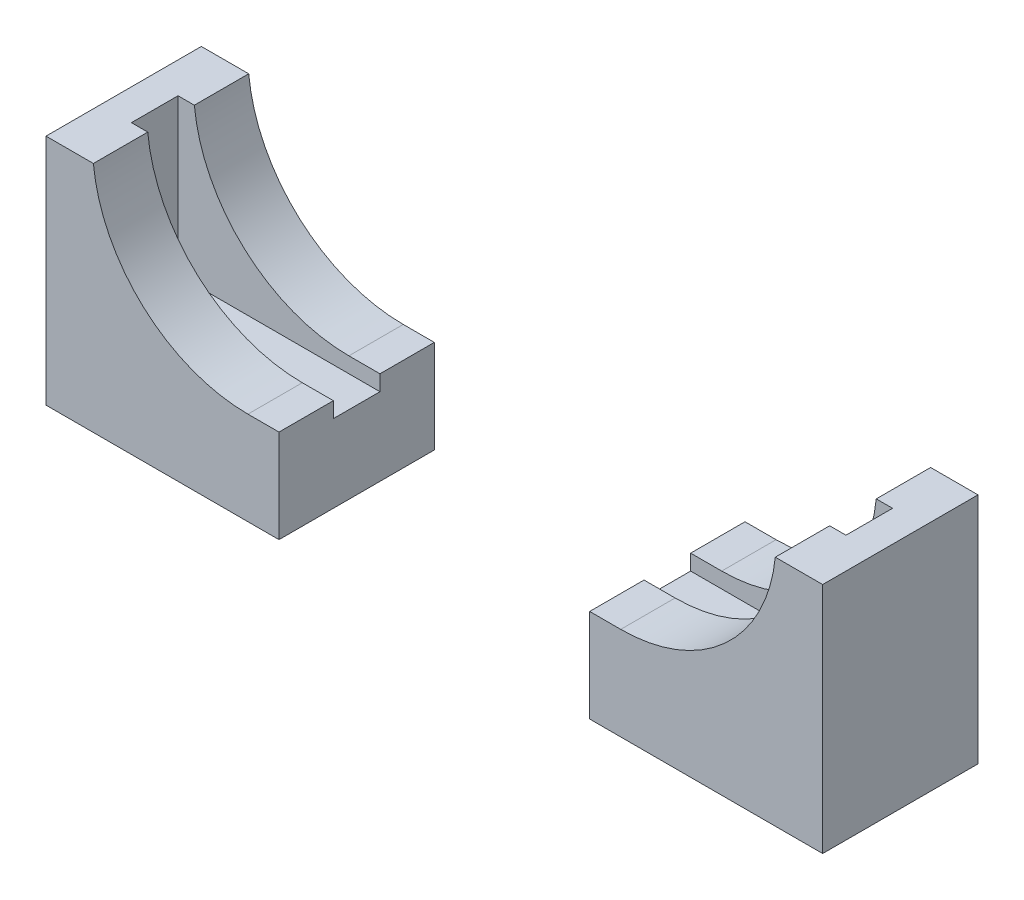
ISO-10303-21;
HEADER;
FILE_DESCRIPTION(('STEP AP214'),'2;1');
FILE_NAME('part.step','',(''),(''),'','','');
FILE_SCHEMA(('AUTOMOTIVE_DESIGN { 1 0 10303 214 1 1 1 1 }'));
ENDSEC;
DATA;
#1=APPLICATION_CONTEXT('core data for automotive mechanical design processes');
#2=APPLICATION_PROTOCOL_DEFINITION('international standard','automotive_design',2000,#1);
#3=PRODUCT_CONTEXT('',#1,'mechanical');
#4=PRODUCT('Part','Part','',(#3));
#5=PRODUCT_RELATED_PRODUCT_CATEGORY('part','',(#4));
#6=PRODUCT_DEFINITION_FORMATION('','',#4);
#7=PRODUCT_DEFINITION_CONTEXT('part definition',#1,'design');
#8=PRODUCT_DEFINITION('design','',#6,#7);
#9=PRODUCT_DEFINITION_SHAPE('','',#8);
#10=(LENGTH_UNIT() NAMED_UNIT(*) SI_UNIT(.MILLI.,.METRE.));
#11=(NAMED_UNIT(*) PLANE_ANGLE_UNIT() SI_UNIT($,.RADIAN.));
#12=(NAMED_UNIT(*) SI_UNIT($,.STERADIAN.) SOLID_ANGLE_UNIT());
#13=UNCERTAINTY_MEASURE_WITH_UNIT(LENGTH_MEASURE(1.E-05),#10,'distance_accuracy_value','');
#14=(GEOMETRIC_REPRESENTATION_CONTEXT(3) GLOBAL_UNCERTAINTY_ASSIGNED_CONTEXT((#13)) GLOBAL_UNIT_ASSIGNED_CONTEXT((#10,
#11,#12)) REPRESENTATION_CONTEXT('',''));
#15=CARTESIAN_POINT('',(0.,0.,0.));
#16=DIRECTION('',(0.,0.,1.));
#17=DIRECTION('',(1.,0.,0.));
#18=AXIS2_PLACEMENT_3D('',#15,#16,#17);
#19=CARTESIAN_POINT('',(25.,15.,5.));
#20=DIRECTION('',(-1.,0.,0.));
#21=DIRECTION('',(0.,0.,1.));
#22=AXIS2_PLACEMENT_3D('',#19,#20,#21);
#23=PLANE('',#22);
#24=DIRECTION('',(0.,0.,-1.));
#25=VECTOR('',#24,1.);
#26=CARTESIAN_POINT('',(25.,0.,5.));
#27=LINE('',#26,#25);
#28=CARTESIAN_POINT('',(25.,0.,5.));
#29=VERTEX_POINT('',#28);
#30=CARTESIAN_POINT('',(25.,0.,-5.));
#31=VERTEX_POINT('',#30);
#32=EDGE_CURVE('E219',#29,#31,#27,.T.);
#33=ORIENTED_EDGE('',*,*,#32,.T.);
#34=DIRECTION('',(0.,-1.,0.));
#35=VECTOR('',#34,1.);
#36=CARTESIAN_POINT('',(25.,15.,-5.));
#37=LINE('',#36,#35);
#38=CARTESIAN_POINT('',(25.,15.,-5.));
#39=VERTEX_POINT('',#38);
#40=EDGE_CURVE('E151',#39,#31,#37,.T.);
#41=ORIENTED_EDGE('',*,*,#40,.F.);
#42=DIRECTION('',(0.,0.,-1.));
#43=VECTOR('',#42,1.);
#44=CARTESIAN_POINT('',(25.,15.,5.));
#45=LINE('',#44,#43);
#46=CARTESIAN_POINT('',(25.,15.,5.));
#47=VERTEX_POINT('',#46);
#48=EDGE_CURVE('E207',#47,#39,#45,.T.);
#49=ORIENTED_EDGE('',*,*,#48,.F.);
#50=DIRECTION('',(0.,-1.,0.));
#51=VECTOR('',#50,1.);
#52=CARTESIAN_POINT('',(25.,15.,5.));
#53=LINE('',#52,#51);
#54=EDGE_CURVE('E204',#47,#29,#53,.T.);
#55=ORIENTED_EDGE('',*,*,#54,.T.);
#56=EDGE_LOOP('',(#33,#41,#49,#55));
#57=FACE_BOUND('',#56,.T.);
#58=ADVANCED_FACE('F44',(#57),#23,.F.);
#59=CARTESIAN_POINT('',(-25.,15.,-5.));
#60=DIRECTION('',(0.,0.,1.));
#61=DIRECTION('',(1.,0.,0.));
#62=AXIS2_PLACEMENT_3D('',#59,#60,#61);
#63=PLANE('',#62);
#64=DIRECTION('',(1.,0.,0.));
#65=VECTOR('',#64,1.);
#66=CARTESIAN_POINT('',(0.,6.,-5.));
#67=LINE('',#66,#65);
#68=CARTESIAN_POINT('',(10.,6.,-5.));
#69=VERTEX_POINT('',#68);
#70=CARTESIAN_POINT('',(12.,6.,-5.));
#71=VERTEX_POINT('',#70);
#72=EDGE_CURVE('E203',#69,#71,#67,.T.);
#73=ORIENTED_EDGE('',*,*,#72,.T.);
#74=CARTESIAN_POINT('',(12.,16.,-5.));
#75=DIRECTION('',(0.,0.,1.));
#76=DIRECTION('',(1.,0.,0.));
#77=AXIS2_PLACEMENT_3D('',#74,#75,#76);
#78=CIRCLE('',#77,10.);
#79=CARTESIAN_POINT('',(21.9498743710662,15.,-5.));
#80=VERTEX_POINT('',#79);
#81=EDGE_CURVE('E154',#71,#80,#78,.T.);
#82=ORIENTED_EDGE('',*,*,#81,.T.);
#83=DIRECTION('',(-1.,0.,0.));
#84=VECTOR('',#83,1.);
#85=CARTESIAN_POINT('',(-25.,15.,-5.));
#86=LINE('',#85,#84);
#87=EDGE_CURVE('E197',#39,#80,#86,.T.);
#88=ORIENTED_EDGE('',*,*,#87,.F.);
#89=ORIENTED_EDGE('',*,*,#40,.T.);
#90=DIRECTION('',(-1.,0.,0.));
#91=VECTOR('',#90,1.);
#92=CARTESIAN_POINT('',(-25.,0.,-5.));
#93=LINE('',#92,#91);
#94=CARTESIAN_POINT('',(10.,0.,-5.));
#95=VERTEX_POINT('',#94);
#96=EDGE_CURVE('E141',#31,#95,#93,.T.);
#97=ORIENTED_EDGE('',*,*,#96,.T.);
#98=DIRECTION('',(0.,1.,0.));
#99=VECTOR('',#98,1.);
#100=CARTESIAN_POINT('',(10.,0.,-5.));
#101=LINE('',#100,#99);
#102=EDGE_CURVE('E133',#95,#69,#101,.T.);
#103=ORIENTED_EDGE('',*,*,#102,.T.);
#104=EDGE_LOOP('',(#73,#82,#88,#89,#97,#103));
#105=FACE_BOUND('',#104,.T.);
#106=ADVANCED_FACE('F46',(#105),#63,.F.);
#107=CARTESIAN_POINT('',(-25.,15.,5.));
#108=DIRECTION('',(0.,0.,-1.));
#109=DIRECTION('',(-1.,0.,0.));
#110=AXIS2_PLACEMENT_3D('',#107,#108,#109);
#111=PLANE('',#110);
#112=DIRECTION('',(1.,0.,0.));
#113=VECTOR('',#112,1.);
#114=CARTESIAN_POINT('',(-25.,15.,5.));
#115=LINE('',#114,#113);
#116=CARTESIAN_POINT('',(21.9498743710662,15.,5.));
#117=VERTEX_POINT('',#116);
#118=EDGE_CURVE('E206',#117,#47,#115,.T.);
#119=ORIENTED_EDGE('',*,*,#118,.F.);
#120=CARTESIAN_POINT('',(12.,16.,5.));
#121=DIRECTION('',(0.,0.,1.));
#122=DIRECTION('',(1.,0.,0.));
#123=AXIS2_PLACEMENT_3D('',#120,#121,#122);
#124=CIRCLE('',#123,10.);
#125=CARTESIAN_POINT('',(12.,6.,5.));
#126=VERTEX_POINT('',#125);
#127=EDGE_CURVE('E192',#126,#117,#124,.T.);
#128=ORIENTED_EDGE('',*,*,#127,.F.);
#129=DIRECTION('',(1.,0.,0.));
#130=VECTOR('',#129,1.);
#131=CARTESIAN_POINT('',(0.,6.,5.));
#132=LINE('',#131,#130);
#133=CARTESIAN_POINT('',(10.,6.,5.));
#134=VERTEX_POINT('',#133);
#135=EDGE_CURVE('E187',#134,#126,#132,.T.);
#136=ORIENTED_EDGE('',*,*,#135,.F.);
#137=DIRECTION('',(0.,1.,0.));
#138=VECTOR('',#137,1.);
#139=CARTESIAN_POINT('',(10.,0.,5.));
#140=LINE('',#139,#138);
#141=CARTESIAN_POINT('',(10.,0.,5.));
#142=VERTEX_POINT('',#141);
#143=EDGE_CURVE('E12',#142,#134,#140,.T.);
#144=ORIENTED_EDGE('',*,*,#143,.F.);
#145=DIRECTION('',(1.,0.,0.));
#146=VECTOR('',#145,1.);
#147=CARTESIAN_POINT('',(-25.,0.,5.));
#148=LINE('',#147,#146);
#149=EDGE_CURVE('E140',#142,#29,#148,.T.);
#150=ORIENTED_EDGE('',*,*,#149,.T.);
#151=ORIENTED_EDGE('',*,*,#54,.F.);
#152=EDGE_LOOP('',(#119,#128,#136,#144,#150,#151));
#153=FACE_BOUND('',#152,.T.);
#154=ADVANCED_FACE('F215',(#153),#111,.F.);
#155=CARTESIAN_POINT('',(0.,15.,0.));
#156=DIRECTION('',(0.,-1.,0.));
#157=DIRECTION('',(0.,0.,-1.));
#158=AXIS2_PLACEMENT_3D('',#155,#156,#157);
#159=PLANE('',#158);
#160=ORIENTED_EDGE('',*,*,#87,.T.);
#161=DIRECTION('',(0.,0.,1.));
#162=VECTOR('',#161,1.);
#163=CARTESIAN_POINT('',(21.9498743710662,15.,-5.));
#164=LINE('',#163,#162);
#165=CARTESIAN_POINT('',(21.9498743710662,15.,-1.5));
#166=VERTEX_POINT('',#165);
#167=EDGE_CURVE('E193',#80,#166,#164,.T.);
#168=ORIENTED_EDGE('',*,*,#167,.T.);
#169=DIRECTION('',(-1.,0.,0.));
#170=VECTOR('',#169,1.);
#171=CARTESIAN_POINT('',(-23.,15.,-1.5));
#172=LINE('',#171,#170);
#173=CARTESIAN_POINT('',(23.,15.,-1.5));
#174=VERTEX_POINT('',#173);
#175=EDGE_CURVE('E48',#174,#166,#172,.T.);
#176=ORIENTED_EDGE('',*,*,#175,.F.);
#177=DIRECTION('',(0.,0.,-1.));
#178=VECTOR('',#177,1.);
#179=CARTESIAN_POINT('',(23.,15.,-1.5));
#180=LINE('',#179,#178);
#181=CARTESIAN_POINT('',(23.,15.,1.5));
#182=VERTEX_POINT('',#181);
#183=EDGE_CURVE('E224',#182,#174,#180,.T.);
#184=ORIENTED_EDGE('',*,*,#183,.F.);
#185=DIRECTION('',(1.,0.,0.));
#186=VECTOR('',#185,1.);
#187=CARTESIAN_POINT('',(-23.,15.,1.5));
#188=LINE('',#187,#186);
#189=CARTESIAN_POINT('',(21.9498743710662,15.,1.5));
#190=VERTEX_POINT('',#189);
#191=EDGE_CURVE('E166',#190,#182,#188,.T.);
#192=ORIENTED_EDGE('',*,*,#191,.F.);
#193=EDGE_CURVE('E196',#190,#117,#164,.T.);
#194=ORIENTED_EDGE('',*,*,#193,.T.);
#195=ORIENTED_EDGE('',*,*,#118,.T.);
#196=ORIENTED_EDGE('',*,*,#48,.T.);
#197=EDGE_LOOP('',(#160,#168,#176,#184,#192,#194,#195,#196));
#198=FACE_BOUND('',#197,.T.);
#199=ADVANCED_FACE('F238',(#198),#159,.F.);
#200=CARTESIAN_POINT('',(0.,0.,0.));
#201=DIRECTION('',(0.,-1.,0.));
#202=DIRECTION('',(0.,0.,-1.));
#203=AXIS2_PLACEMENT_3D('',#200,#201,#202);
#204=PLANE('',#203);
#205=DIRECTION('',(0.,0.,1.));
#206=VECTOR('',#205,1.);
#207=CARTESIAN_POINT('',(10.,0.,-5.));
#208=LINE('',#207,#206);
#209=EDGE_CURVE('E54',#95,#142,#208,.T.);
#210=ORIENTED_EDGE('',*,*,#209,.F.);
#211=ORIENTED_EDGE('',*,*,#96,.F.);
#212=ORIENTED_EDGE('',*,*,#32,.F.);
#213=ORIENTED_EDGE('',*,*,#149,.F.);
#214=EDGE_LOOP('',(#210,#211,#212,#213));
#215=FACE_BOUND('',#214,.T.);
#216=ADVANCED_FACE('F145',(#215),#204,.T.);
#217=CARTESIAN_POINT('',(23.,5.,-1.5));
#218=DIRECTION('',(1.,0.,0.));
#219=DIRECTION('',(0.,0.,-1.));
#220=AXIS2_PLACEMENT_3D('',#217,#218,#219);
#221=PLANE('',#220);
#222=ORIENTED_EDGE('',*,*,#183,.T.);
#223=DIRECTION('',(0.,1.,0.));
#224=VECTOR('',#223,1.);
#225=CARTESIAN_POINT('',(23.,5.,-1.5));
#226=LINE('',#225,#224);
#227=CARTESIAN_POINT('',(23.,5.,-1.5));
#228=VERTEX_POINT('',#227);
#229=EDGE_CURVE('E162',#228,#174,#226,.T.);
#230=ORIENTED_EDGE('',*,*,#229,.F.);
#231=DIRECTION('',(0.,0.,-1.));
#232=VECTOR('',#231,1.);
#233=CARTESIAN_POINT('',(23.,5.,-1.5));
#234=LINE('',#233,#232);
#235=CARTESIAN_POINT('',(23.,5.,1.5));
#236=VERTEX_POINT('',#235);
#237=EDGE_CURVE('E161',#236,#228,#234,.T.);
#238=ORIENTED_EDGE('',*,*,#237,.F.);
#239=DIRECTION('',(0.,1.,0.));
#240=VECTOR('',#239,1.);
#241=CARTESIAN_POINT('',(23.,5.,1.5));
#242=LINE('',#241,#240);
#243=EDGE_CURVE('E177',#236,#182,#242,.T.);
#244=ORIENTED_EDGE('',*,*,#243,.T.);
#245=EDGE_LOOP('',(#222,#230,#238,#244));
#246=FACE_BOUND('',#245,.T.);
#247=ADVANCED_FACE('F229',(#246),#221,.F.);
#248=CARTESIAN_POINT('',(-23.,5.,1.5));
#249=DIRECTION('',(0.,0.,1.));
#250=DIRECTION('',(1.,0.,0.));
#251=AXIS2_PLACEMENT_3D('',#248,#249,#250);
#252=PLANE('',#251);
#253=DIRECTION('',(1.,0.,0.));
#254=VECTOR('',#253,1.);
#255=CARTESIAN_POINT('',(-23.,6.,1.5));
#256=LINE('',#255,#254);
#257=CARTESIAN_POINT('',(10.,6.,1.5));
#258=VERTEX_POINT('',#257);
#259=CARTESIAN_POINT('',(12.,6.,1.5));
#260=VERTEX_POINT('',#259);
#261=EDGE_CURVE('E174',#258,#260,#256,.T.);
#262=ORIENTED_EDGE('',*,*,#261,.T.);
#263=CARTESIAN_POINT('',(12.,16.,1.5));
#264=DIRECTION('',(0.,0.,1.));
#265=DIRECTION('',(1.,0.,0.));
#266=AXIS2_PLACEMENT_3D('',#263,#264,#265);
#267=CIRCLE('',#266,10.);
#268=EDGE_CURVE('E167',#260,#190,#267,.T.);
#269=ORIENTED_EDGE('',*,*,#268,.T.);
#270=ORIENTED_EDGE('',*,*,#191,.T.);
#271=ORIENTED_EDGE('',*,*,#243,.F.);
#272=DIRECTION('',(1.,0.,0.));
#273=VECTOR('',#272,1.);
#274=CARTESIAN_POINT('',(-23.,5.,1.5));
#275=LINE('',#274,#273);
#276=CARTESIAN_POINT('',(10.,5.,1.5));
#277=VERTEX_POINT('',#276);
#278=EDGE_CURVE('E159',#277,#236,#275,.T.);
#279=ORIENTED_EDGE('',*,*,#278,.F.);
#280=DIRECTION('',(0.,1.,0.));
#281=VECTOR('',#280,1.);
#282=CARTESIAN_POINT('',(10.,5.,1.5));
#283=LINE('',#282,#281);
#284=EDGE_CURVE('E63',#277,#258,#283,.T.);
#285=ORIENTED_EDGE('',*,*,#284,.T.);
#286=EDGE_LOOP('',(#262,#269,#270,#271,#279,#285));
#287=FACE_BOUND('',#286,.T.);
#288=ADVANCED_FACE('F247',(#287),#252,.F.);
#289=CARTESIAN_POINT('',(-23.,5.,-1.5));
#290=DIRECTION('',(0.,0.,-1.));
#291=DIRECTION('',(-1.,0.,0.));
#292=AXIS2_PLACEMENT_3D('',#289,#290,#291);
#293=PLANE('',#292);
#294=ORIENTED_EDGE('',*,*,#175,.T.);
#295=CARTESIAN_POINT('',(12.,16.,-1.5));
#296=DIRECTION('',(0.,0.,-1.));
#297=DIRECTION('',(-1.,0.,0.));
#298=AXIS2_PLACEMENT_3D('',#295,#296,#297);
#299=CIRCLE('',#298,10.);
#300=CARTESIAN_POINT('',(12.,6.,-1.5));
#301=VERTEX_POINT('',#300);
#302=EDGE_CURVE('E239',#166,#301,#299,.T.);
#303=ORIENTED_EDGE('',*,*,#302,.T.);
#304=DIRECTION('',(-1.,0.,0.));
#305=VECTOR('',#304,1.);
#306=CARTESIAN_POINT('',(-23.,6.,-1.5));
#307=LINE('',#306,#305);
#308=CARTESIAN_POINT('',(10.,6.,-1.5));
#309=VERTEX_POINT('',#308);
#310=EDGE_CURVE('E184',#301,#309,#307,.T.);
#311=ORIENTED_EDGE('',*,*,#310,.T.);
#312=DIRECTION('',(0.,-1.,0.));
#313=VECTOR('',#312,1.);
#314=CARTESIAN_POINT('',(10.,5.,-1.5));
#315=LINE('',#314,#313);
#316=CARTESIAN_POINT('',(10.,5.,-1.5));
#317=VERTEX_POINT('',#316);
#318=EDGE_CURVE('E182',#309,#317,#315,.T.);
#319=ORIENTED_EDGE('',*,*,#318,.T.);
#320=DIRECTION('',(-1.,0.,0.));
#321=VECTOR('',#320,1.);
#322=CARTESIAN_POINT('',(-23.,5.,-1.5));
#323=LINE('',#322,#321);
#324=EDGE_CURVE('E163',#228,#317,#323,.T.);
#325=ORIENTED_EDGE('',*,*,#324,.F.);
#326=ORIENTED_EDGE('',*,*,#229,.T.);
#327=EDGE_LOOP('',(#294,#303,#311,#319,#325,#326));
#328=FACE_BOUND('',#327,.T.);
#329=ADVANCED_FACE('F235',(#328),#293,.F.);
#330=CARTESIAN_POINT('',(0.,5.,0.));
#331=DIRECTION('',(0.,1.,0.));
#332=DIRECTION('',(0.,0.,1.));
#333=AXIS2_PLACEMENT_3D('',#330,#331,#332);
#334=PLANE('',#333);
#335=DIRECTION('',(0.,0.,-1.));
#336=VECTOR('',#335,1.);
#337=CARTESIAN_POINT('',(10.,5.,0.));
#338=LINE('',#337,#336);
#339=EDGE_CURVE('E148',#277,#317,#338,.T.);
#340=ORIENTED_EDGE('',*,*,#339,.F.);
#341=ORIENTED_EDGE('',*,*,#278,.T.);
#342=ORIENTED_EDGE('',*,*,#237,.T.);
#343=ORIENTED_EDGE('',*,*,#324,.T.);
#344=EDGE_LOOP('',(#340,#341,#342,#343));
#345=FACE_BOUND('',#344,.T.);
#346=ADVANCED_FACE('F246',(#345),#334,.T.);
#347=CARTESIAN_POINT('',(12.,16.,-5.));
#348=DIRECTION('',(0.,0.,1.));
#349=DIRECTION('',(1.,0.,0.));
#350=AXIS2_PLACEMENT_3D('',#347,#348,#349);
#351=CYLINDRICAL_SURFACE('',#350,10.);
#352=DIRECTION('',(0.,0.,1.));
#353=VECTOR('',#352,1.);
#354=CARTESIAN_POINT('',(12.,6.,-5.));
#355=LINE('',#354,#353);
#356=EDGE_CURVE('E165',#260,#126,#355,.T.);
#357=ORIENTED_EDGE('',*,*,#356,.T.);
#358=ORIENTED_EDGE('',*,*,#127,.T.);
#359=ORIENTED_EDGE('',*,*,#193,.F.);
#360=ORIENTED_EDGE('',*,*,#268,.F.);
#361=EDGE_LOOP('',(#357,#358,#359,#360));
#362=FACE_BOUND('',#361,.T.);
#363=ADVANCED_FACE('F271',(#362),#351,.F.);
#364=ORIENTED_EDGE('',*,*,#167,.F.);
#365=ORIENTED_EDGE('',*,*,#81,.F.);
#366=EDGE_CURVE('E189',#71,#301,#355,.T.);
#367=ORIENTED_EDGE('',*,*,#366,.T.);
#368=ORIENTED_EDGE('',*,*,#302,.F.);
#369=EDGE_LOOP('',(#364,#365,#367,#368));
#370=FACE_BOUND('',#369,.T.);
#371=ADVANCED_FACE('F269',(#370),#351,.F.);
#372=CARTESIAN_POINT('',(0.,6.,-5.));
#373=DIRECTION('',(0.,-1.,0.));
#374=DIRECTION('',(0.,0.,-1.));
#375=AXIS2_PLACEMENT_3D('',#372,#373,#374);
#376=PLANE('',#375);
#377=DIRECTION('',(0.,0.,1.));
#378=VECTOR('',#377,1.);
#379=CARTESIAN_POINT('',(10.,6.,-5.));
#380=LINE('',#379,#378);
#381=EDGE_CURVE('E188',#258,#134,#380,.T.);
#382=ORIENTED_EDGE('',*,*,#381,.T.);
#383=ORIENTED_EDGE('',*,*,#135,.T.);
#384=ORIENTED_EDGE('',*,*,#356,.F.);
#385=ORIENTED_EDGE('',*,*,#261,.F.);
#386=EDGE_LOOP('',(#382,#383,#384,#385));
#387=FACE_BOUND('',#386,.T.);
#388=ADVANCED_FACE('F266',(#387),#376,.F.);
#389=ORIENTED_EDGE('',*,*,#366,.F.);
#390=ORIENTED_EDGE('',*,*,#72,.F.);
#391=EDGE_CURVE('E130',#69,#309,#380,.T.);
#392=ORIENTED_EDGE('',*,*,#391,.T.);
#393=ORIENTED_EDGE('',*,*,#310,.F.);
#394=EDGE_LOOP('',(#389,#390,#392,#393));
#395=FACE_BOUND('',#394,.T.);
#396=ADVANCED_FACE('F265',(#395),#376,.F.);
#397=CARTESIAN_POINT('',(10.,0.,-5.));
#398=DIRECTION('',(1.,0.,0.));
#399=DIRECTION('',(0.,0.,-1.));
#400=AXIS2_PLACEMENT_3D('',#397,#398,#399);
#401=PLANE('',#400);
#402=ORIENTED_EDGE('',*,*,#339,.T.);
#403=ORIENTED_EDGE('',*,*,#318,.F.);
#404=ORIENTED_EDGE('',*,*,#391,.F.);
#405=ORIENTED_EDGE('',*,*,#102,.F.);
#406=ORIENTED_EDGE('',*,*,#209,.T.);
#407=ORIENTED_EDGE('',*,*,#143,.T.);
#408=ORIENTED_EDGE('',*,*,#381,.F.);
#409=ORIENTED_EDGE('',*,*,#284,.F.);
#410=EDGE_LOOP('',(#402,#403,#404,#405,#406,#407,#408,#409));
#411=FACE_BOUND('',#410,.T.);
#412=ADVANCED_FACE('F135',(#411),#401,.F.);
#413=CLOSED_SHELL('',(#58,#106,#154,#199,#216,#247,#288,#329,#346,#363,#371,#388,#396,#412));
#414=MANIFOLD_SOLID_BREP('B2',#413);
#415=CARTESIAN_POINT('',(-25.,15.,5.));
#416=DIRECTION('',(1.,0.,0.));
#417=DIRECTION('',(0.,0.,-1.));
#418=AXIS2_PLACEMENT_3D('',#415,#416,#417);
#419=PLANE('',#418);
#420=DIRECTION('',(0.,0.,1.));
#421=VECTOR('',#420,1.);
#422=CARTESIAN_POINT('',(-25.,0.,5.));
#423=LINE('',#422,#421);
#424=CARTESIAN_POINT('',(-25.,0.,-5.));
#425=VERTEX_POINT('',#424);
#426=CARTESIAN_POINT('',(-25.,0.,5.));
#427=VERTEX_POINT('',#426);
#428=EDGE_CURVE('E416',#425,#427,#423,.T.);
#429=ORIENTED_EDGE('',*,*,#428,.T.);
#430=DIRECTION('',(0.,-1.,0.));
#431=VECTOR('',#430,1.);
#432=CARTESIAN_POINT('',(-25.,15.,5.));
#433=LINE('',#432,#431);
#434=CARTESIAN_POINT('',(-25.,15.,5.));
#435=VERTEX_POINT('',#434);
#436=EDGE_CURVE('E418',#435,#427,#433,.T.);
#437=ORIENTED_EDGE('',*,*,#436,.F.);
#438=DIRECTION('',(0.,0.,1.));
#439=VECTOR('',#438,1.);
#440=CARTESIAN_POINT('',(-25.,15.,5.));
#441=LINE('',#440,#439);
#442=CARTESIAN_POINT('',(-25.,15.,-5.));
#443=VERTEX_POINT('',#442);
#444=EDGE_CURVE('E403',#443,#435,#441,.T.);
#445=ORIENTED_EDGE('',*,*,#444,.F.);
#446=DIRECTION('',(0.,-1.,0.));
#447=VECTOR('',#446,1.);
#448=CARTESIAN_POINT('',(-25.,15.,-5.));
#449=LINE('',#448,#447);
#450=EDGE_CURVE('E421',#443,#425,#449,.T.);
#451=ORIENTED_EDGE('',*,*,#450,.T.);
#452=EDGE_LOOP('',(#429,#437,#445,#451));
#453=FACE_BOUND('',#452,.T.);
#454=ADVANCED_FACE('F379',(#453),#419,.F.);
#455=CARTESIAN_POINT('',(-23.,5.,-1.5));
#456=DIRECTION('',(-1.,0.,0.));
#457=DIRECTION('',(0.,0.,1.));
#458=AXIS2_PLACEMENT_3D('',#455,#456,#457);
#459=PLANE('',#458);
#460=DIRECTION('',(0.,0.,1.));
#461=VECTOR('',#460,1.);
#462=CARTESIAN_POINT('',(-23.,15.,-1.5));
#463=LINE('',#462,#461);
#464=CARTESIAN_POINT('',(-23.,15.,-1.5));
#465=VERTEX_POINT('',#464);
#466=CARTESIAN_POINT('',(-23.,15.,1.5));
#467=VERTEX_POINT('',#466);
#468=EDGE_CURVE('E505',#465,#467,#463,.T.);
#469=ORIENTED_EDGE('',*,*,#468,.T.);
#470=DIRECTION('',(0.,1.,0.));
#471=VECTOR('',#470,1.);
#472=CARTESIAN_POINT('',(-23.,5.,1.5));
#473=LINE('',#472,#471);
#474=CARTESIAN_POINT('',(-23.,5.,1.5));
#475=VERTEX_POINT('',#474);
#476=EDGE_CURVE('E510',#475,#467,#473,.T.);
#477=ORIENTED_EDGE('',*,*,#476,.F.);
#478=DIRECTION('',(0.,0.,1.));
#479=VECTOR('',#478,1.);
#480=CARTESIAN_POINT('',(-23.,5.,-1.5));
#481=LINE('',#480,#479);
#482=CARTESIAN_POINT('',(-23.,5.,-1.5));
#483=VERTEX_POINT('',#482);
#484=EDGE_CURVE('E495',#483,#475,#481,.T.);
#485=ORIENTED_EDGE('',*,*,#484,.F.);
#486=DIRECTION('',(0.,1.,0.));
#487=VECTOR('',#486,1.);
#488=CARTESIAN_POINT('',(-23.,5.,-1.5));
#489=LINE('',#488,#487);
#490=EDGE_CURVE('E502',#483,#465,#489,.T.);
#491=ORIENTED_EDGE('',*,*,#490,.T.);
#492=EDGE_LOOP('',(#469,#477,#485,#491));
#493=FACE_BOUND('',#492,.T.);
#494=ADVANCED_FACE('F563',(#493),#459,.F.);
#495=CARTESIAN_POINT('',(0.,0.,0.));
#496=DIRECTION('',(0.,-1.,0.));
#497=DIRECTION('',(0.,0.,-1.));
#498=AXIS2_PLACEMENT_3D('',#495,#496,#497);
#499=PLANE('',#498);
#500=DIRECTION('',(-1.,0.,0.));
#501=VECTOR('',#500,1.);
#502=CARTESIAN_POINT('',(-25.,0.,-5.));
#503=LINE('',#502,#501);
#504=CARTESIAN_POINT('',(-10.,0.,-5.));
#505=VERTEX_POINT('',#504);
#506=EDGE_CURVE('E426',#505,#425,#503,.T.);
#507=ORIENTED_EDGE('',*,*,#506,.F.);
#508=DIRECTION('',(0.,0.,1.));
#509=VECTOR('',#508,1.);
#510=CARTESIAN_POINT('',(-10.,0.,-5.));
#511=LINE('',#510,#509);
#512=CARTESIAN_POINT('',(-10.,0.,5.));
#513=VERTEX_POINT('',#512);
#514=EDGE_CURVE('E439',#505,#513,#511,.T.);
#515=ORIENTED_EDGE('',*,*,#514,.T.);
#516=DIRECTION('',(1.,0.,0.));
#517=VECTOR('',#516,1.);
#518=CARTESIAN_POINT('',(-25.,0.,5.));
#519=LINE('',#518,#517);
#520=EDGE_CURVE('E425',#427,#513,#519,.T.);
#521=ORIENTED_EDGE('',*,*,#520,.F.);
#522=ORIENTED_EDGE('',*,*,#428,.F.);
#523=EDGE_LOOP('',(#507,#515,#521,#522));
#524=FACE_BOUND('',#523,.T.);
#525=ADVANCED_FACE('F437',(#524),#499,.T.);
#526=CARTESIAN_POINT('',(0.,5.,0.));
#527=DIRECTION('',(0.,1.,0.));
#528=DIRECTION('',(0.,0.,1.));
#529=AXIS2_PLACEMENT_3D('',#526,#527,#528);
#530=PLANE('',#529);
#531=DIRECTION('',(1.,0.,0.));
#532=VECTOR('',#531,1.);
#533=CARTESIAN_POINT('',(-23.,5.,1.5));
#534=LINE('',#533,#532);
#535=CARTESIAN_POINT('',(-10.,5.,1.5));
#536=VERTEX_POINT('',#535);
#537=EDGE_CURVE('E499',#475,#536,#534,.T.);
#538=ORIENTED_EDGE('',*,*,#537,.T.);
#539=DIRECTION('',(0.,0.,-1.));
#540=VECTOR('',#539,1.);
#541=CARTESIAN_POINT('',(-10.,5.,0.));
#542=LINE('',#541,#540);
#543=CARTESIAN_POINT('',(-10.,5.,-1.5));
#544=VERTEX_POINT('',#543);
#545=EDGE_CURVE('E446',#536,#544,#542,.T.);
#546=ORIENTED_EDGE('',*,*,#545,.T.);
#547=DIRECTION('',(-1.,0.,0.));
#548=VECTOR('',#547,1.);
#549=CARTESIAN_POINT('',(-23.,5.,-1.5));
#550=LINE('',#549,#548);
#551=EDGE_CURVE('E477',#544,#483,#550,.T.);
#552=ORIENTED_EDGE('',*,*,#551,.T.);
#553=ORIENTED_EDGE('',*,*,#484,.T.);
#554=EDGE_LOOP('',(#538,#546,#552,#553));
#555=FACE_BOUND('',#554,.T.);
#556=ADVANCED_FACE('F587',(#555),#530,.T.);
#557=CARTESIAN_POINT('',(-23.,5.,-1.5));
#558=DIRECTION('',(0.,0.,-1.));
#559=DIRECTION('',(-1.,0.,0.));
#560=AXIS2_PLACEMENT_3D('',#557,#558,#559);
#561=PLANE('',#560);
#562=CARTESIAN_POINT('',(-12.,16.,-1.5));
#563=DIRECTION('',(0.,0.,-1.));
#564=DIRECTION('',(-1.,0.,0.));
#565=AXIS2_PLACEMENT_3D('',#562,#563,#564);
#566=CIRCLE('',#565,10.);
#567=CARTESIAN_POINT('',(-21.9498743710662,15.,-1.5));
#568=VERTEX_POINT('',#567);
#569=CARTESIAN_POINT('',(-12.,6.,-1.5));
#570=VERTEX_POINT('',#569);
#571=EDGE_CURVE('E42',#568,#570,#566,.F.);
#572=ORIENTED_EDGE('',*,*,#571,.F.);
#573=DIRECTION('',(-1.,0.,0.));
#574=VECTOR('',#573,1.);
#575=CARTESIAN_POINT('',(-23.,15.,-1.5));
#576=LINE('',#575,#574);
#577=EDGE_CURVE('E493',#568,#465,#576,.T.);
#578=ORIENTED_EDGE('',*,*,#577,.T.);
#579=ORIENTED_EDGE('',*,*,#490,.F.);
#580=ORIENTED_EDGE('',*,*,#551,.F.);
#581=DIRECTION('',(0.,-1.,0.));
#582=VECTOR('',#581,1.);
#583=CARTESIAN_POINT('',(-10.,5.,-1.5));
#584=LINE('',#583,#582);
#585=CARTESIAN_POINT('',(-10.,6.,-1.5));
#586=VERTEX_POINT('',#585);
#587=EDGE_CURVE('E394',#586,#544,#584,.T.);
#588=ORIENTED_EDGE('',*,*,#587,.F.);
#589=DIRECTION('',(1.,0.,0.));
#590=VECTOR('',#589,1.);
#591=CARTESIAN_POINT('',(-23.,6.,-1.5));
#592=LINE('',#591,#590);
#593=EDGE_CURVE('E387',#570,#586,#592,.T.);
#594=ORIENTED_EDGE('',*,*,#593,.F.);
#595=EDGE_LOOP('',(#572,#578,#579,#580,#588,#594));
#596=FACE_BOUND('',#595,.T.);
#597=ADVANCED_FACE('F474',(#596),#561,.F.);
#598=CARTESIAN_POINT('',(-23.,5.,1.5));
#599=DIRECTION('',(0.,0.,1.));
#600=DIRECTION('',(1.,0.,0.));
#601=AXIS2_PLACEMENT_3D('',#598,#599,#600);
#602=PLANE('',#601);
#603=CARTESIAN_POINT('',(-12.,16.,1.5));
#604=DIRECTION('',(0.,0.,1.));
#605=DIRECTION('',(1.,0.,0.));
#606=AXIS2_PLACEMENT_3D('',#603,#604,#605);
#607=CIRCLE('',#606,10.);
#608=CARTESIAN_POINT('',(-12.,6.,1.5));
#609=VERTEX_POINT('',#608);
#610=CARTESIAN_POINT('',(-21.9498743710662,15.,1.5));
#611=VERTEX_POINT('',#610);
#612=EDGE_CURVE('E490',#609,#611,#607,.F.);
#613=ORIENTED_EDGE('',*,*,#612,.F.);
#614=DIRECTION('',(-1.,0.,0.));
#615=VECTOR('',#614,1.);
#616=CARTESIAN_POINT('',(-23.,6.,1.5));
#617=LINE('',#616,#615);
#618=CARTESIAN_POINT('',(-10.,6.,1.5));
#619=VERTEX_POINT('',#618);
#620=EDGE_CURVE('E481',#619,#609,#617,.T.);
#621=ORIENTED_EDGE('',*,*,#620,.F.);
#622=DIRECTION('',(0.,1.,0.));
#623=VECTOR('',#622,1.);
#624=CARTESIAN_POINT('',(-10.,5.,1.5));
#625=LINE('',#624,#623);
#626=EDGE_CURVE('E478',#536,#619,#625,.T.);
#627=ORIENTED_EDGE('',*,*,#626,.F.);
#628=ORIENTED_EDGE('',*,*,#537,.F.);
#629=ORIENTED_EDGE('',*,*,#476,.T.);
#630=DIRECTION('',(1.,0.,0.));
#631=VECTOR('',#630,1.);
#632=CARTESIAN_POINT('',(-23.,15.,1.5));
#633=LINE('',#632,#631);
#634=EDGE_CURVE('E496',#467,#611,#633,.T.);
#635=ORIENTED_EDGE('',*,*,#634,.T.);
#636=EDGE_LOOP('',(#613,#621,#627,#628,#629,#635));
#637=FACE_BOUND('',#636,.T.);
#638=ADVANCED_FACE('F557',(#637),#602,.F.);
#639=CARTESIAN_POINT('',(0.,15.,0.));
#640=DIRECTION('',(0.,-1.,0.));
#641=DIRECTION('',(0.,0.,-1.));
#642=AXIS2_PLACEMENT_3D('',#639,#640,#641);
#643=PLANE('',#642);
#644=DIRECTION('',(0.,0.,1.));
#645=VECTOR('',#644,1.);
#646=CARTESIAN_POINT('',(-21.9498743710662,15.,-5.));
#647=LINE('',#646,#645);
#648=CARTESIAN_POINT('',(-21.9498743710662,15.,-5.));
#649=VERTEX_POINT('',#648);
#650=EDGE_CURVE('E479',#649,#568,#647,.T.);
#651=ORIENTED_EDGE('',*,*,#650,.F.);
#652=DIRECTION('',(-1.,0.,0.));
#653=VECTOR('',#652,1.);
#654=CARTESIAN_POINT('',(-25.,15.,-5.));
#655=LINE('',#654,#653);
#656=EDGE_CURVE('E440',#649,#443,#655,.T.);
#657=ORIENTED_EDGE('',*,*,#656,.T.);
#658=ORIENTED_EDGE('',*,*,#444,.T.);
#659=DIRECTION('',(1.,0.,0.));
#660=VECTOR('',#659,1.);
#661=CARTESIAN_POINT('',(-25.,15.,5.));
#662=LINE('',#661,#660);
#663=CARTESIAN_POINT('',(-21.9498743710662,15.,5.));
#664=VERTEX_POINT('',#663);
#665=EDGE_CURVE('E434',#435,#664,#662,.T.);
#666=ORIENTED_EDGE('',*,*,#665,.T.);
#667=EDGE_CURVE('E484',#611,#664,#647,.T.);
#668=ORIENTED_EDGE('',*,*,#667,.F.);
#669=ORIENTED_EDGE('',*,*,#634,.F.);
#670=ORIENTED_EDGE('',*,*,#468,.F.);
#671=ORIENTED_EDGE('',*,*,#577,.F.);
#672=EDGE_LOOP('',(#651,#657,#658,#666,#668,#669,#670,#671));
#673=FACE_BOUND('',#672,.T.);
#674=ADVANCED_FACE('F567',(#673),#643,.F.);
#675=CARTESIAN_POINT('',(-25.,15.,5.));
#676=DIRECTION('',(0.,0.,-1.));
#677=DIRECTION('',(-1.,0.,0.));
#678=AXIS2_PLACEMENT_3D('',#675,#676,#677);
#679=PLANE('',#678);
#680=CARTESIAN_POINT('',(-12.,16.,5.));
#681=DIRECTION('',(0.,0.,1.));
#682=DIRECTION('',(1.,0.,0.));
#683=AXIS2_PLACEMENT_3D('',#680,#681,#682);
#684=CIRCLE('',#683,10.);
#685=CARTESIAN_POINT('',(-12.,6.,5.));
#686=VERTEX_POINT('',#685);
#687=EDGE_CURVE('E578',#686,#664,#684,.F.);
#688=ORIENTED_EDGE('',*,*,#687,.T.);
#689=ORIENTED_EDGE('',*,*,#665,.F.);
#690=ORIENTED_EDGE('',*,*,#436,.T.);
#691=ORIENTED_EDGE('',*,*,#520,.T.);
#692=DIRECTION('',(0.,1.,0.));
#693=VECTOR('',#692,1.);
#694=CARTESIAN_POINT('',(-10.,0.,5.));
#695=LINE('',#694,#693);
#696=CARTESIAN_POINT('',(-10.,6.,5.));
#697=VERTEX_POINT('',#696);
#698=EDGE_CURVE('E572',#513,#697,#695,.T.);
#699=ORIENTED_EDGE('',*,*,#698,.T.);
#700=DIRECTION('',(-1.,0.,0.));
#701=VECTOR('',#700,1.);
#702=CARTESIAN_POINT('',(0.,6.,5.));
#703=LINE('',#702,#701);
#704=EDGE_CURVE('E575',#697,#686,#703,.T.);
#705=ORIENTED_EDGE('',*,*,#704,.T.);
#706=EDGE_LOOP('',(#688,#689,#690,#691,#699,#705));
#707=FACE_BOUND('',#706,.T.);
#708=ADVANCED_FACE('F431',(#707),#679,.F.);
#709=CARTESIAN_POINT('',(-25.,15.,-5.));
#710=DIRECTION('',(0.,0.,1.));
#711=DIRECTION('',(1.,0.,0.));
#712=AXIS2_PLACEMENT_3D('',#709,#710,#711);
#713=PLANE('',#712);
#714=CARTESIAN_POINT('',(-12.,16.,-5.));
#715=DIRECTION('',(0.,0.,1.));
#716=DIRECTION('',(1.,0.,0.));
#717=AXIS2_PLACEMENT_3D('',#714,#715,#716);
#718=CIRCLE('',#717,10.);
#719=CARTESIAN_POINT('',(-12.,6.,-5.));
#720=VERTEX_POINT('',#719);
#721=EDGE_CURVE('E574',#720,#649,#718,.F.);
#722=ORIENTED_EDGE('',*,*,#721,.F.);
#723=DIRECTION('',(-1.,0.,0.));
#724=VECTOR('',#723,1.);
#725=CARTESIAN_POINT('',(0.,6.,-5.));
#726=LINE('',#725,#724);
#727=CARTESIAN_POINT('',(-10.,6.,-5.));
#728=VERTEX_POINT('',#727);
#729=EDGE_CURVE('E582',#728,#720,#726,.T.);
#730=ORIENTED_EDGE('',*,*,#729,.F.);
#731=DIRECTION('',(0.,1.,0.));
#732=VECTOR('',#731,1.);
#733=CARTESIAN_POINT('',(-10.,0.,-5.));
#734=LINE('',#733,#732);
#735=EDGE_CURVE('E470',#505,#728,#734,.T.);
#736=ORIENTED_EDGE('',*,*,#735,.F.);
#737=ORIENTED_EDGE('',*,*,#506,.T.);
#738=ORIENTED_EDGE('',*,*,#450,.F.);
#739=ORIENTED_EDGE('',*,*,#656,.F.);
#740=EDGE_LOOP('',(#722,#730,#736,#737,#738,#739));
#741=FACE_BOUND('',#740,.T.);
#742=ADVANCED_FACE('F381',(#741),#713,.F.);
#743=CARTESIAN_POINT('',(-10.,0.,-5.));
#744=DIRECTION('',(1.,0.,0.));
#745=DIRECTION('',(0.,0.,-1.));
#746=AXIS2_PLACEMENT_3D('',#743,#744,#745);
#747=PLANE('',#746);
#748=ORIENTED_EDGE('',*,*,#626,.T.);
#749=DIRECTION('',(0.,0.,1.));
#750=VECTOR('',#749,1.);
#751=CARTESIAN_POINT('',(-10.,6.,-5.));
#752=LINE('',#751,#750);
#753=EDGE_CURVE('E471',#619,#697,#752,.T.);
#754=ORIENTED_EDGE('',*,*,#753,.T.);
#755=ORIENTED_EDGE('',*,*,#698,.F.);
#756=ORIENTED_EDGE('',*,*,#514,.F.);
#757=ORIENTED_EDGE('',*,*,#735,.T.);
#758=EDGE_CURVE('E456',#728,#586,#752,.T.);
#759=ORIENTED_EDGE('',*,*,#758,.T.);
#760=ORIENTED_EDGE('',*,*,#587,.T.);
#761=ORIENTED_EDGE('',*,*,#545,.F.);
#762=EDGE_LOOP('',(#748,#754,#755,#756,#757,#759,#760,#761));
#763=FACE_BOUND('',#762,.T.);
#764=ADVANCED_FACE('F468',(#763),#747,.T.);
#765=CARTESIAN_POINT('',(0.,6.,-5.));
#766=DIRECTION('',(0.,1.,0.));
#767=DIRECTION('',(0.,0.,1.));
#768=AXIS2_PLACEMENT_3D('',#765,#766,#767);
#769=PLANE('',#768);
#770=ORIENTED_EDGE('',*,*,#593,.T.);
#771=ORIENTED_EDGE('',*,*,#758,.F.);
#772=ORIENTED_EDGE('',*,*,#729,.T.);
#773=DIRECTION('',(0.,0.,1.));
#774=VECTOR('',#773,1.);
#775=CARTESIAN_POINT('',(-12.,6.,-5.));
#776=LINE('',#775,#774);
#777=EDGE_CURVE('E460',#720,#570,#776,.T.);
#778=ORIENTED_EDGE('',*,*,#777,.T.);
#779=EDGE_LOOP('',(#770,#771,#772,#778));
#780=FACE_BOUND('',#779,.T.);
#781=ADVANCED_FACE('F453',(#780),#769,.T.);
#782=CARTESIAN_POINT('',(-12.,16.,-5.));
#783=DIRECTION('',(0.,0.,1.));
#784=DIRECTION('',(1.,0.,0.));
#785=AXIS2_PLACEMENT_3D('',#782,#783,#784);
#786=CYLINDRICAL_SURFACE('',#785,10.);
#787=ORIENTED_EDGE('',*,*,#571,.T.);
#788=ORIENTED_EDGE('',*,*,#777,.F.);
#789=ORIENTED_EDGE('',*,*,#721,.T.);
#790=ORIENTED_EDGE('',*,*,#650,.T.);
#791=EDGE_LOOP('',(#787,#788,#789,#790));
#792=FACE_BOUND('',#791,.T.);
#793=ADVANCED_FACE('F585',(#792),#786,.F.);
#794=ORIENTED_EDGE('',*,*,#620,.T.);
#795=EDGE_CURVE('E581',#609,#686,#776,.T.);
#796=ORIENTED_EDGE('',*,*,#795,.T.);
#797=ORIENTED_EDGE('',*,*,#704,.F.);
#798=ORIENTED_EDGE('',*,*,#753,.F.);
#799=EDGE_LOOP('',(#794,#796,#797,#798));
#800=FACE_BOUND('',#799,.T.);
#801=ADVANCED_FACE('F592',(#800),#769,.T.);
#802=ORIENTED_EDGE('',*,*,#612,.T.);
#803=ORIENTED_EDGE('',*,*,#667,.T.);
#804=ORIENTED_EDGE('',*,*,#687,.F.);
#805=ORIENTED_EDGE('',*,*,#795,.F.);
#806=EDGE_LOOP('',(#802,#803,#804,#805));
#807=FACE_BOUND('',#806,.T.);
#808=ADVANCED_FACE('F594',(#807),#786,.F.);
#809=CLOSED_SHELL('',(#454,#494,#525,#556,#597,#638,#674,#708,#742,#764,#781,#793,#801,#808));
#810=MANIFOLD_SOLID_BREP('B6',#809);
#811=ADVANCED_BREP_SHAPE_REPRESENTATION('',(#18,#414,#810),#14);
#812=SHAPE_DEFINITION_REPRESENTATION(#9,#811);
ENDSEC;
END-ISO-10303-21;
